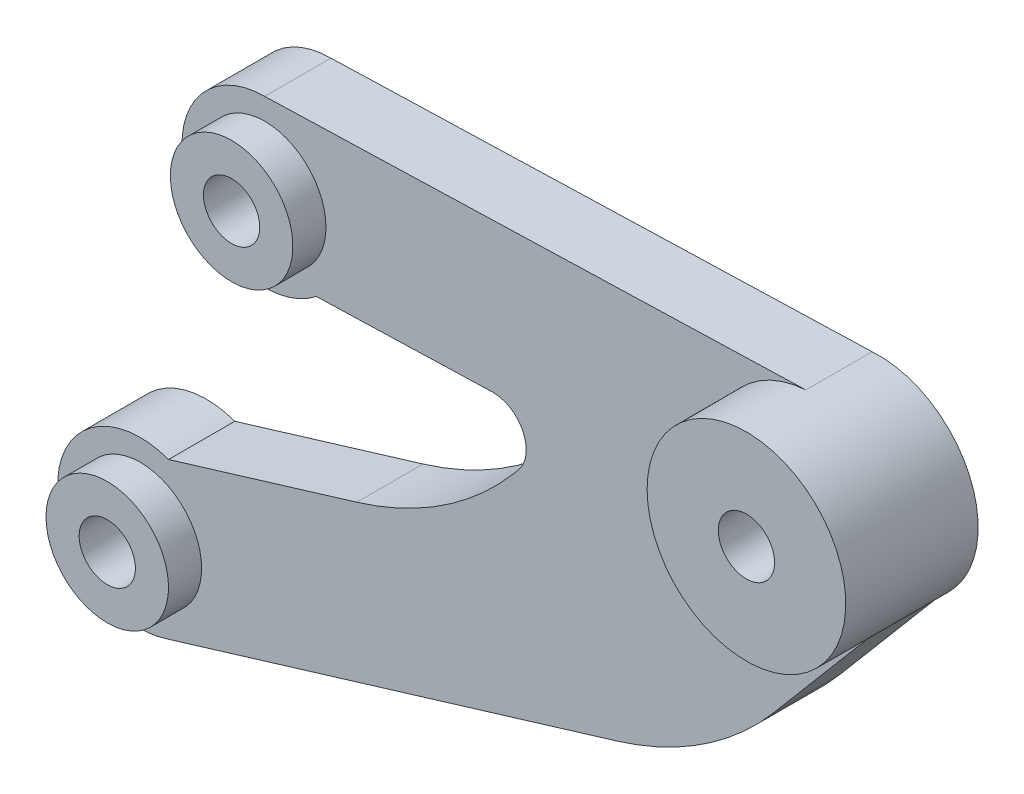
ISO-10303-21;
HEADER;
FILE_DESCRIPTION(('STEP AP214'),'2;1');
FILE_NAME('part.step','',(''),(''),'','','');
FILE_SCHEMA(('AUTOMOTIVE_DESIGN { 1 0 10303 214 1 1 1 1 }'));
ENDSEC;
DATA;
#1=APPLICATION_CONTEXT('core data for automotive mechanical design processes');
#2=APPLICATION_PROTOCOL_DEFINITION('international standard','automotive_design',2000,#1);
#3=PRODUCT_CONTEXT('',#1,'mechanical');
#4=PRODUCT('Part','Part','',(#3));
#5=PRODUCT_RELATED_PRODUCT_CATEGORY('part','',(#4));
#6=PRODUCT_DEFINITION_FORMATION('','',#4);
#7=PRODUCT_DEFINITION_CONTEXT('part definition',#1,'design');
#8=PRODUCT_DEFINITION('design','',#6,#7);
#9=PRODUCT_DEFINITION_SHAPE('','',#8);
#10=(LENGTH_UNIT() NAMED_UNIT(*) SI_UNIT(.MILLI.,.METRE.));
#11=(NAMED_UNIT(*) PLANE_ANGLE_UNIT() SI_UNIT($,.RADIAN.));
#12=(NAMED_UNIT(*) SI_UNIT($,.STERADIAN.) SOLID_ANGLE_UNIT());
#13=UNCERTAINTY_MEASURE_WITH_UNIT(LENGTH_MEASURE(1.E-05),#10,'distance_accuracy_value','');
#14=(GEOMETRIC_REPRESENTATION_CONTEXT(3) GLOBAL_UNCERTAINTY_ASSIGNED_CONTEXT((#13)) GLOBAL_UNIT_ASSIGNED_CONTEXT((#10,
#11,#12)) REPRESENTATION_CONTEXT('',''));
#15=CARTESIAN_POINT('',(0.,0.,0.));
#16=DIRECTION('',(0.,0.,1.));
#17=DIRECTION('',(1.,0.,0.));
#18=AXIS2_PLACEMENT_3D('',#15,#16,#17);
#19=CARTESIAN_POINT('',(-0.794785675554382,26.3501943878582,-2.));
#20=DIRECTION('',(0.0301487106170735,-0.999545424304533,0.));
#21=DIRECTION('',(0.999545424304533,0.0301487106170735,0.));
#22=AXIS2_PLACEMENT_3D('',#19,#20,#21);
#23=PLANE('',#22);
#24=DIRECTION('',(0.,0.,1.));
#25=VECTOR('',#24,1.);
#26=CARTESIAN_POINT('',(7.51288670694863,26.6007739057783,-2.));
#27=LINE('',#26,#25);
#28=CARTESIAN_POINT('',(7.51288670694863,26.6007739057783,-2.));
#29=VERTEX_POINT('',#28);
#30=CARTESIAN_POINT('',(7.51288670694863,26.6007739057783,2.));
#31=VERTEX_POINT('',#30);
#32=EDGE_CURVE('E176',#29,#31,#27,.T.);
#33=ORIENTED_EDGE('',*,*,#32,.T.);
#34=DIRECTION('',(0.999545424304533,0.0301487106170735,0.));
#35=VECTOR('',#34,1.);
#36=CARTESIAN_POINT('',(-0.794785675554382,26.3501943878582,2.));
#37=LINE('',#36,#35);
#38=CARTESIAN_POINT('',(40.203783053973,27.5868105078317,2.));
#39=VERTEX_POINT('',#38);
#40=EDGE_CURVE('E237',#31,#39,#37,.T.);
#41=ORIENTED_EDGE('',*,*,#40,.T.);
#42=DIRECTION('',(0.,0.,1.));
#43=VECTOR('',#42,1.);
#44=CARTESIAN_POINT('',(40.203783053973,27.5868105078317,-2.));
#45=LINE('',#44,#43);
#46=CARTESIAN_POINT('',(40.203783053973,27.5868105078317,-2.));
#47=VERTEX_POINT('',#46);
#48=EDGE_CURVE('E138',#47,#39,#45,.T.);
#49=ORIENTED_EDGE('',*,*,#48,.F.);
#50=DIRECTION('',(0.999545424304533,0.0301487106170735,0.));
#51=VECTOR('',#50,1.);
#52=CARTESIAN_POINT('',(-0.794785675554382,26.3501943878582,-2.));
#53=LINE('',#52,#51);
#54=EDGE_CURVE('E260',#29,#47,#53,.T.);
#55=ORIENTED_EDGE('',*,*,#54,.F.);
#56=EDGE_LOOP('',(#33,#41,#49,#55));
#57=FACE_BOUND('',#56,.T.);
#58=ADVANCED_FACE('F41',(#57),#23,.F.);
#59=CARTESIAN_POINT('',(40.6128867069486,21.6007739057783,-2.));
#60=DIRECTION('',(0.,0.,1.));
#61=DIRECTION('',(1.,0.,0.));
#62=AXIS2_PLACEMENT_3D('',#59,#60,#61);
#63=CYLINDRICAL_SURFACE('',#62,6.);
#64=ORIENTED_EDGE('',*,*,#48,.T.);
#65=CARTESIAN_POINT('',(40.6128867069486,21.6007739057783,2.));
#66=DIRECTION('',(0.,0.,-1.));
#67=DIRECTION('',(-1.,0.,0.));
#68=AXIS2_PLACEMENT_3D('',#65,#66,#67);
#69=CIRCLE('',#68,6.);
#70=CARTESIAN_POINT('',(44.2966352413054,16.8647421559245,2.));
#71=VERTEX_POINT('',#70);
#72=EDGE_CURVE('E129',#71,#39,#69,.T.);
#73=ORIENTED_EDGE('',*,*,#72,.F.);
#74=DIRECTION('',(0.,0.,1.));
#75=VECTOR('',#74,1.);
#76=CARTESIAN_POINT('',(44.2966352413055,16.8647421559245,-2.));
#77=LINE('',#76,#75);
#78=CARTESIAN_POINT('',(44.2966352413055,16.8647421559245,-2.));
#79=VERTEX_POINT('',#78);
#80=EDGE_CURVE('E135',#79,#71,#77,.T.);
#81=ORIENTED_EDGE('',*,*,#80,.F.);
#82=CARTESIAN_POINT('',(40.6128867069486,21.6007739057783,-2.));
#83=DIRECTION('',(0.,0.,1.));
#84=DIRECTION('',(1.,0.,0.));
#85=AXIS2_PLACEMENT_3D('',#82,#83,#84);
#86=CIRCLE('',#85,6.);
#87=EDGE_CURVE('E179',#79,#47,#86,.T.);
#88=ORIENTED_EDGE('',*,*,#87,.T.);
#89=EDGE_LOOP('',(#64,#73,#81,#88));
#90=FACE_BOUND('',#89,.T.);
#91=CARTESIAN_POINT('',(40.6128867069486,21.6007739057783,6.));
#92=DIRECTION('',(0.,0.,-1.));
#93=DIRECTION('',(-1.,0.,0.));
#94=AXIS2_PLACEMENT_3D('',#91,#92,#93);
#95=CIRCLE('',#94,6.);
#96=CARTESIAN_POINT('',(34.6128867069486,21.6007739057783,6.));
#97=VERTEX_POINT('',#96);
#98=EDGE_CURVE('E292',#97,#97,#95,.T.);
#99=ORIENTED_EDGE('',*,*,#98,.T.);
#100=EDGE_LOOP('',(#99));
#101=FACE_BOUND('',#100,.T.);
#102=ADVANCED_FACE('F131',(#90,#101),#63,.T.);
#103=CARTESIAN_POINT('',(17.5048121782462,-14.8074807423079,-2.));
#104=DIRECTION('',(0.763478400343073,-0.645833362570859,0.));
#105=DIRECTION('',(0.645833362570859,0.763478400343073,0.));
#106=AXIS2_PLACEMENT_3D('',#103,#104,#105);
#107=PLANE('',#106);
#108=DIRECTION('',(0.645833362570859,0.763478400343073,0.));
#109=VECTOR('',#108,1.);
#110=CARTESIAN_POINT('',(17.5048121782462,-14.8074807423079,2.));
#111=LINE('',#110,#109);
#112=CARTESIAN_POINT('',(38.2696943494356,9.7399334084015,2.));
#113=VERTEX_POINT('',#112);
#114=EDGE_CURVE('E146',#113,#71,#111,.T.);
#115=ORIENTED_EDGE('',*,*,#114,.F.);
#116=DIRECTION('',(0.,0.,1.));
#117=VECTOR('',#116,1.);
#118=CARTESIAN_POINT('',(38.2696943494356,9.73993340840149,-2.));
#119=LINE('',#118,#117);
#120=CARTESIAN_POINT('',(38.2696943494356,9.7399334084015,-2.));
#121=VERTEX_POINT('',#120);
#122=EDGE_CURVE('E192',#113,#121,#119,.F.);
#123=ORIENTED_EDGE('',*,*,#122,.T.);
#124=DIRECTION('',(0.645833362570859,0.763478400343073,0.));
#125=VECTOR('',#124,1.);
#126=CARTESIAN_POINT('',(17.5048121782462,-14.8074807423079,-2.));
#127=LINE('',#126,#125);
#128=EDGE_CURVE('E158',#121,#79,#127,.T.);
#129=ORIENTED_EDGE('',*,*,#128,.T.);
#130=ORIENTED_EDGE('',*,*,#80,.T.);
#131=EDGE_LOOP('',(#115,#123,#129,#130));
#132=FACE_BOUND('',#131,.T.);
#133=ADVANCED_FACE('F156',(#132),#107,.T.);
#134=CARTESIAN_POINT('',(1.45139171596717,-4.78294599887616,-2.));
#135=DIRECTION('',(0.290376446947038,-0.956912492894943,0.));
#136=DIRECTION('',(0.956912492894943,0.290376446947038,0.));
#137=AXIS2_PLACEMENT_3D('',#134,#135,#136);
#138=PLANE('',#137);
#139=DIRECTION('',(0.956912492894943,0.290376446947038,0.));
#140=VECTOR('',#139,1.);
#141=CARTESIAN_POINT('',(1.45139171596717,-4.78294599887616,-2.));
#142=LINE('',#141,#140);
#143=CARTESIAN_POINT('',(1.57575227360064,-4.74520861208887,-2.));
#144=VERTEX_POINT('',#143);
#145=CARTESIAN_POINT('',(28.8076552815149,3.5183508019198,-2.));
#146=VERTEX_POINT('',#145);
#147=EDGE_CURVE('E279',#144,#146,#142,.T.);
#148=ORIENTED_EDGE('',*,*,#147,.T.);
#149=DIRECTION('',(0.,0.,1.));
#150=VECTOR('',#149,1.);
#151=CARTESIAN_POINT('',(28.8076552815149,3.5183508019198,-2.));
#152=LINE('',#151,#150);
#153=CARTESIAN_POINT('',(28.8076552815149,3.5183508019198,2.));
#154=VERTEX_POINT('',#153);
#155=EDGE_CURVE('E186',#146,#154,#152,.T.);
#156=ORIENTED_EDGE('',*,*,#155,.T.);
#157=DIRECTION('',(0.956912492894943,0.290376446947038,0.));
#158=VECTOR('',#157,1.);
#159=CARTESIAN_POINT('',(1.45139171596717,-4.78294599887616,2.));
#160=LINE('',#159,#158);
#161=CARTESIAN_POINT('',(1.57575227360064,-4.74520861208887,2.));
#162=VERTEX_POINT('',#161);
#163=EDGE_CURVE('E154',#162,#154,#160,.T.);
#164=ORIENTED_EDGE('',*,*,#163,.F.);
#165=DIRECTION('',(0.,0.,1.));
#166=VECTOR('',#165,1.);
#167=CARTESIAN_POINT('',(1.57575227360064,-4.74520861208887,-2.));
#168=LINE('',#167,#166);
#169=EDGE_CURVE('E160',#144,#162,#168,.T.);
#170=ORIENTED_EDGE('',*,*,#169,.F.);
#171=EDGE_LOOP('',(#148,#156,#164,#170));
#172=FACE_BOUND('',#171,.T.);
#173=ADVANCED_FACE('F387',(#172),#138,.T.);
#174=CARTESIAN_POINT('',(0.,0.,-2.));
#175=DIRECTION('',(0.,0.,1.));
#176=DIRECTION('',(1.,0.,0.));
#177=AXIS2_PLACEMENT_3D('',#174,#175,#176);
#178=CYLINDRICAL_SURFACE('',#177,5.);
#179=ORIENTED_EDGE('',*,*,#169,.T.);
#180=CARTESIAN_POINT('',(0.,0.,2.));
#181=DIRECTION('',(0.,0.,1.));
#182=DIRECTION('',(1.,0.,0.));
#183=AXIS2_PLACEMENT_3D('',#180,#181,#182);
#184=CIRCLE('',#183,5.);
#185=CARTESIAN_POINT('',(1.70658461953951,4.69974136909162,2.));
#186=VERTEX_POINT('',#185);
#187=EDGE_CURVE('E243',#186,#162,#184,.T.);
#188=ORIENTED_EDGE('',*,*,#187,.F.);
#189=DIRECTION('',(0.,0.,1.));
#190=VECTOR('',#189,1.);
#191=CARTESIAN_POINT('',(1.70658461953951,4.69974136909162,-2.));
#192=LINE('',#191,#190);
#193=CARTESIAN_POINT('',(1.70658461953951,4.69974136909162,-2.));
#194=VERTEX_POINT('',#193);
#195=EDGE_CURVE('E166',#194,#186,#192,.T.);
#196=ORIENTED_EDGE('',*,*,#195,.F.);
#197=CARTESIAN_POINT('',(0.,0.,-2.));
#198=DIRECTION('',(0.,0.,1.));
#199=DIRECTION('',(1.,0.,0.));
#200=AXIS2_PLACEMENT_3D('',#197,#198,#199);
#201=CIRCLE('',#200,5.);
#202=EDGE_CURVE('E275',#194,#144,#201,.T.);
#203=ORIENTED_EDGE('',*,*,#202,.T.);
#204=EDGE_LOOP('',(#179,#188,#196,#203));
#205=FACE_BOUND('',#204,.T.);
#206=ADVANCED_FACE('F390',(#205),#178,.T.);
#207=CARTESIAN_POINT('',(-1.16199630655618,3.82926643717832,-2.));
#208=DIRECTION('',(-0.290376446947038,0.956912492894943,0.));
#209=DIRECTION('',(-0.956912492894943,-0.290376446947038,0.));
#210=AXIS2_PLACEMENT_3D('',#207,#208,#209);
#211=PLANE('',#210);
#212=DIRECTION('',(-0.956912492894943,-0.290376446947038,0.));
#213=VECTOR('',#212,1.);
#214=CARTESIAN_POINT('',(-1.16199630655618,3.82926643717832,2.));
#215=LINE('',#214,#213);
#216=CARTESIAN_POINT('',(13.0793967045248,8.15083725252361,2.));
#217=VERTEX_POINT('',#216);
#218=EDGE_CURVE('E235',#217,#186,#215,.T.);
#219=ORIENTED_EDGE('',*,*,#218,.F.);
#220=DIRECTION('',(0.,0.,1.));
#221=VECTOR('',#220,1.);
#222=CARTESIAN_POINT('',(13.0793967045248,8.15083725252361,-2.));
#223=LINE('',#222,#221);
#224=CARTESIAN_POINT('',(13.0793967045248,8.15083725252361,-2.));
#225=VERTEX_POINT('',#224);
#226=EDGE_CURVE('E183',#217,#225,#223,.F.);
#227=ORIENTED_EDGE('',*,*,#226,.T.);
#228=DIRECTION('',(-0.956912492894943,-0.290376446947038,0.));
#229=VECTOR('',#228,1.);
#230=CARTESIAN_POINT('',(-1.16199630655618,3.82926643717832,-2.));
#231=LINE('',#230,#229);
#232=EDGE_CURVE('E272',#225,#194,#231,.T.);
#233=ORIENTED_EDGE('',*,*,#232,.T.);
#234=ORIENTED_EDGE('',*,*,#195,.T.);
#235=EDGE_LOOP('',(#219,#227,#233,#234));
#236=FACE_BOUND('',#235,.T.);
#237=ADVANCED_FACE('F394',(#236),#211,.T.);
#238=CARTESIAN_POINT('',(6.0526361731001,-5.11998030374497,-2.));
#239=DIRECTION('',(-0.763478400343073,0.645833362570859,0.));
#240=DIRECTION('',(-0.645833362570859,-0.763478400343073,0.));
#241=AXIS2_PLACEMENT_3D('',#238,#239,#240);
#242=PLANE('',#241);
#243=DIRECTION('',(-0.645833362570859,-0.763478400343073,0.));
#244=VECTOR('',#243,1.);
#245=CARTESIAN_POINT('',(6.0526361731001,-5.11998030374497,2.));
#246=LINE('',#245,#244);
#247=CARTESIAN_POINT('',(22.8356424846143,14.7202192806435,2.));
#248=VERTEX_POINT('',#247);
#249=CARTESIAN_POINT('',(22.5414357724455,14.3724198590053,2.));
#250=VERTEX_POINT('',#249);
#251=EDGE_CURVE('E231',#248,#250,#246,.T.);
#252=ORIENTED_EDGE('',*,*,#251,.F.);
#253=DIRECTION('',(0.,0.,1.));
#254=VECTOR('',#253,1.);
#255=CARTESIAN_POINT('',(22.8356424846143,14.7202192806435,-2.));
#256=LINE('',#255,#254);
#257=CARTESIAN_POINT('',(22.8356424846143,14.7202192806435,-2.));
#258=VERTEX_POINT('',#257);
#259=EDGE_CURVE('E63',#248,#258,#256,.F.);
#260=ORIENTED_EDGE('',*,*,#259,.T.);
#261=DIRECTION('',(-0.645833362570859,-0.763478400343073,0.));
#262=VECTOR('',#261,1.);
#263=CARTESIAN_POINT('',(6.0526361731001,-5.11998030374497,-2.));
#264=LINE('',#263,#262);
#265=CARTESIAN_POINT('',(22.5414357724455,14.3724198590053,-2.));
#266=VERTEX_POINT('',#265);
#267=EDGE_CURVE('E269',#258,#266,#264,.T.);
#268=ORIENTED_EDGE('',*,*,#267,.T.);
#269=DIRECTION('',(0.,0.,1.));
#270=VECTOR('',#269,1.);
#271=CARTESIAN_POINT('',(22.5414357724455,14.3724198590053,2.));
#272=LINE('',#271,#270);
#273=EDGE_CURVE('E164',#266,#250,#272,.T.);
#274=ORIENTED_EDGE('',*,*,#273,.T.);
#275=EDGE_LOOP('',(#252,#260,#268,#274));
#276=FACE_BOUND('',#275,.T.);
#277=ADVANCED_FACE('F351',(#276),#242,.T.);
#278=CARTESIAN_POINT('',(-0.523447280000722,17.3542855691174,-2.));
#279=DIRECTION('',(0.0301487106170736,-0.999545424304533,0.));
#280=DIRECTION('',(0.999545424304533,0.0301487106170736,0.));
#281=AXIS2_PLACEMENT_3D('',#278,#279,#280);
#282=PLANE('',#281);
#283=DIRECTION('',(0.999545424304533,0.0301487106170736,0.));
#284=VECTOR('',#283,1.);
#285=CARTESIAN_POINT('',(-0.523447280000722,17.3542855691174,-2.));
#286=LINE('',#285,#284);
#287=CARTESIAN_POINT('',(10.6291548266564,17.6906750571438,-2.));
#288=VERTEX_POINT('',#287);
#289=CARTESIAN_POINT('',(21.248388262694,18.0109768543943,-2.));
#290=VERTEX_POINT('',#289);
#291=EDGE_CURVE('E225',#288,#290,#286,.T.);
#292=ORIENTED_EDGE('',*,*,#291,.T.);
#293=DIRECTION('',(0.,0.,1.));
#294=VECTOR('',#293,1.);
#295=CARTESIAN_POINT('',(21.248388262694,18.0109768543943,2.));
#296=LINE('',#295,#294);
#297=CARTESIAN_POINT('',(21.248388262694,18.0109768543943,2.));
#298=VERTEX_POINT('',#297);
#299=EDGE_CURVE('E211',#290,#298,#296,.T.);
#300=ORIENTED_EDGE('',*,*,#299,.T.);
#301=DIRECTION('',(0.999545424304533,0.0301487106170736,0.));
#302=VECTOR('',#301,1.);
#303=CARTESIAN_POINT('',(-0.523447280000722,17.3542855691174,2.));
#304=LINE('',#303,#302);
#305=CARTESIAN_POINT('',(10.6291548266564,17.6906750571438,2.));
#306=VERTEX_POINT('',#305);
#307=EDGE_CURVE('E222',#306,#298,#304,.T.);
#308=ORIENTED_EDGE('',*,*,#307,.F.);
#309=DIRECTION('',(0.,0.,1.));
#310=VECTOR('',#309,1.);
#311=CARTESIAN_POINT('',(10.6291548266564,17.6906750571438,-2.));
#312=LINE('',#311,#310);
#313=EDGE_CURVE('E173',#288,#306,#312,.T.);
#314=ORIENTED_EDGE('',*,*,#313,.F.);
#315=EDGE_LOOP('',(#292,#300,#308,#314));
#316=FACE_BOUND('',#315,.T.);
#317=ADVANCED_FACE('F221',(#316),#282,.T.);
#318=CARTESIAN_POINT('',(7.51288670694863,21.6007739057783,-2.));
#319=DIRECTION('',(0.,0.,1.));
#320=DIRECTION('',(1.,0.,0.));
#321=AXIS2_PLACEMENT_3D('',#318,#319,#320);
#322=CYLINDRICAL_SURFACE('',#321,1.7);
#323=CARTESIAN_POINT('',(7.51288670694863,21.6007739057783,-2.));
#324=DIRECTION('',(0.,0.,1.));
#325=DIRECTION('',(1.,0.,0.));
#326=AXIS2_PLACEMENT_3D('',#323,#324,#325);
#327=CIRCLE('',#326,1.7);
#328=CARTESIAN_POINT('',(9.21288670694863,21.6007739057783,-2.));
#329=VERTEX_POINT('',#328);
#330=EDGE_CURVE('E256',#329,#329,#327,.T.);
#331=ORIENTED_EDGE('',*,*,#330,.F.);
#332=EDGE_LOOP('',(#331));
#333=FACE_BOUND('',#332,.T.);
#334=CARTESIAN_POINT('',(7.51288670694863,21.6007739057783,4.));
#335=DIRECTION('',(0.,0.,-1.));
#336=DIRECTION('',(-1.,0.,0.));
#337=AXIS2_PLACEMENT_3D('',#334,#335,#336);
#338=CIRCLE('',#337,1.7);
#339=CARTESIAN_POINT('',(5.81288670694863,21.6007739057783,4.));
#340=VERTEX_POINT('',#339);
#341=EDGE_CURVE('E305',#340,#340,#338,.T.);
#342=ORIENTED_EDGE('',*,*,#341,.F.);
#343=EDGE_LOOP('',(#342));
#344=FACE_BOUND('',#343,.T.);
#345=ADVANCED_FACE('F333',(#333,#344),#322,.F.);
#346=CARTESIAN_POINT('',(40.6128867069486,21.6007739057783,-2.));
#347=DIRECTION('',(0.,0.,1.));
#348=DIRECTION('',(1.,0.,0.));
#349=AXIS2_PLACEMENT_3D('',#346,#347,#348);
#350=CYLINDRICAL_SURFACE('',#349,1.7);
#351=CARTESIAN_POINT('',(40.6128867069486,21.6007739057783,-2.));
#352=DIRECTION('',(0.,0.,1.));
#353=DIRECTION('',(1.,0.,0.));
#354=AXIS2_PLACEMENT_3D('',#351,#352,#353);
#355=CIRCLE('',#354,1.7);
#356=CARTESIAN_POINT('',(42.3128867069486,21.6007739057783,-2.));
#357=VERTEX_POINT('',#356);
#358=EDGE_CURVE('E252',#357,#357,#355,.T.);
#359=ORIENTED_EDGE('',*,*,#358,.F.);
#360=EDGE_LOOP('',(#359));
#361=FACE_BOUND('',#360,.T.);
#362=CARTESIAN_POINT('',(40.6128867069486,21.6007739057783,6.));
#363=DIRECTION('',(0.,0.,-1.));
#364=DIRECTION('',(-1.,0.,0.));
#365=AXIS2_PLACEMENT_3D('',#362,#363,#364);
#366=CIRCLE('',#365,1.7);
#367=CARTESIAN_POINT('',(38.9128867069486,21.6007739057783,6.));
#368=VERTEX_POINT('',#367);
#369=EDGE_CURVE('E295',#368,#368,#366,.T.);
#370=ORIENTED_EDGE('',*,*,#369,.F.);
#371=EDGE_LOOP('',(#370));
#372=FACE_BOUND('',#371,.T.);
#373=ADVANCED_FACE('F324',(#361,#372),#350,.F.);
#374=CARTESIAN_POINT('',(0.,0.,-2.));
#375=DIRECTION('',(0.,0.,1.));
#376=DIRECTION('',(1.,0.,0.));
#377=AXIS2_PLACEMENT_3D('',#374,#375,#376);
#378=CYLINDRICAL_SURFACE('',#377,1.7);
#379=CARTESIAN_POINT('',(0.,0.,-2.));
#380=DIRECTION('',(0.,0.,1.));
#381=DIRECTION('',(1.,0.,0.));
#382=AXIS2_PLACEMENT_3D('',#379,#380,#381);
#383=CIRCLE('',#382,1.7);
#384=CARTESIAN_POINT('',(1.7,0.,-2.));
#385=VERTEX_POINT('',#384);
#386=EDGE_CURVE('E153',#385,#385,#383,.T.);
#387=ORIENTED_EDGE('',*,*,#386,.F.);
#388=EDGE_LOOP('',(#387));
#389=FACE_BOUND('',#388,.T.);
#390=CARTESIAN_POINT('',(0.,0.,4.));
#391=DIRECTION('',(0.,0.,-1.));
#392=DIRECTION('',(-1.,0.,0.));
#393=AXIS2_PLACEMENT_3D('',#390,#391,#392);
#394=CIRCLE('',#393,1.7);
#395=CARTESIAN_POINT('',(-1.7,0.,4.));
#396=VERTEX_POINT('',#395);
#397=EDGE_CURVE('E313',#396,#396,#394,.T.);
#398=ORIENTED_EDGE('',*,*,#397,.F.);
#399=EDGE_LOOP('',(#398));
#400=FACE_BOUND('',#399,.T.);
#401=ADVANCED_FACE('F321',(#389,#400),#378,.F.);
#402=CARTESIAN_POINT('',(7.51288670694863,21.6007739057783,-2.));
#403=DIRECTION('',(0.,0.,1.));
#404=DIRECTION('',(1.,0.,0.));
#405=AXIS2_PLACEMENT_3D('',#402,#403,#404);
#406=CYLINDRICAL_SURFACE('',#405,5.);
#407=ORIENTED_EDGE('',*,*,#313,.T.);
#408=CARTESIAN_POINT('',(7.51288670694863,21.6007739057783,2.));
#409=DIRECTION('',(0.,0.,1.));
#410=DIRECTION('',(1.,0.,0.));
#411=AXIS2_PLACEMENT_3D('',#408,#409,#410);
#412=CIRCLE('',#411,5.);
#413=EDGE_CURVE('E229',#31,#306,#412,.T.);
#414=ORIENTED_EDGE('',*,*,#413,.F.);
#415=ORIENTED_EDGE('',*,*,#32,.F.);
#416=CARTESIAN_POINT('',(7.51288670694863,21.6007739057783,-2.));
#417=DIRECTION('',(0.,0.,1.));
#418=DIRECTION('',(1.,0.,0.));
#419=AXIS2_PLACEMENT_3D('',#416,#417,#418);
#420=CIRCLE('',#419,5.);
#421=EDGE_CURVE('E263',#29,#288,#420,.T.);
#422=ORIENTED_EDGE('',*,*,#421,.T.);
#423=EDGE_LOOP('',(#407,#414,#415,#422));
#424=FACE_BOUND('',#423,.T.);
#425=ADVANCED_FACE('F323',(#424),#406,.T.);
#426=CARTESIAN_POINT('',(0.,0.,-2.));
#427=DIRECTION('',(0.,0.,1.));
#428=DIRECTION('',(1.,0.,0.));
#429=AXIS2_PLACEMENT_3D('',#426,#427,#428);
#430=PLANE('',#429);
#431=ORIENTED_EDGE('',*,*,#386,.T.);
#432=EDGE_LOOP('',(#431));
#433=FACE_BOUND('',#432,.T.);
#434=ORIENTED_EDGE('',*,*,#358,.T.);
#435=EDGE_LOOP('',(#434));
#436=FACE_BOUND('',#435,.T.);
#437=ORIENTED_EDGE('',*,*,#330,.T.);
#438=EDGE_LOOP('',(#437));
#439=FACE_BOUND('',#438,.T.);
#440=ORIENTED_EDGE('',*,*,#128,.F.);
#441=CARTESIAN_POINT('',(23.0001263425741,22.6566006598187,-2.));
#442=DIRECTION('',(0.,0.,1.));
#443=DIRECTION('',(1.,0.,0.));
#444=AXIS2_PLACEMENT_3D('',#441,#442,#443);
#445=CIRCLE('',#444,20.);
#446=EDGE_CURVE('E195',#121,#146,#445,.F.);
#447=ORIENTED_EDGE('',*,*,#446,.T.);
#448=ORIENTED_EDGE('',*,*,#147,.F.);
#449=ORIENTED_EDGE('',*,*,#202,.F.);
#450=ORIENTED_EDGE('',*,*,#232,.F.);
#451=CARTESIAN_POINT('',(7.27186776558407,27.2890871104225,-2.));
#452=DIRECTION('',(0.,0.,1.));
#453=DIRECTION('',(1.,0.,0.));
#454=AXIS2_PLACEMENT_3D('',#451,#452,#453);
#455=CIRCLE('',#454,20.);
#456=EDGE_CURVE('E143',#225,#266,#455,.T.);
#457=ORIENTED_EDGE('',*,*,#456,.T.);
#458=ORIENTED_EDGE('',*,*,#267,.F.);
#459=CARTESIAN_POINT('',(21.3086856839282,16.0118860057853,-2.));
#460=DIRECTION('',(0.,0.,1.));
#461=DIRECTION('',(1.,0.,0.));
#462=AXIS2_PLACEMENT_3D('',#459,#460,#461);
#463=CIRCLE('',#462,2.);
#464=EDGE_CURVE('E11',#258,#290,#463,.T.);
#465=ORIENTED_EDGE('',*,*,#464,.T.);
#466=ORIENTED_EDGE('',*,*,#291,.F.);
#467=ORIENTED_EDGE('',*,*,#421,.F.);
#468=ORIENTED_EDGE('',*,*,#54,.T.);
#469=ORIENTED_EDGE('',*,*,#87,.F.);
#470=EDGE_LOOP('',(#440,#447,#448,#449,#450,#457,#458,#465,#466,#467,#468,#469));
#471=FACE_BOUND('',#470,.T.);
#472=ADVANCED_FACE('F286',(#433,#436,#439,#471),#430,.F.);
#473=CARTESIAN_POINT('',(0.,0.,2.));
#474=DIRECTION('',(0.,0.,1.));
#475=DIRECTION('',(1.,0.,0.));
#476=AXIS2_PLACEMENT_3D('',#473,#474,#475);
#477=PLANE('',#476);
#478=CARTESIAN_POINT('',(0.,0.,2.));
#479=DIRECTION('',(0.,0.,1.));
#480=DIRECTION('',(1.,0.,0.));
#481=AXIS2_PLACEMENT_3D('',#478,#479,#480);
#482=CIRCLE('',#481,3.7);
#483=CARTESIAN_POINT('',(3.7,0.,2.));
#484=VERTEX_POINT('',#483);
#485=EDGE_CURVE('E207',#484,#484,#482,.T.);
#486=ORIENTED_EDGE('',*,*,#485,.F.);
#487=EDGE_LOOP('',(#486));
#488=FACE_BOUND('',#487,.T.);
#489=CARTESIAN_POINT('',(7.51288670694863,21.6007739057783,2.));
#490=DIRECTION('',(0.,0.,1.));
#491=DIRECTION('',(1.,0.,0.));
#492=AXIS2_PLACEMENT_3D('',#489,#490,#491);
#493=CIRCLE('',#492,3.7);
#494=CARTESIAN_POINT('',(11.2128867069486,21.6007739057783,2.));
#495=VERTEX_POINT('',#494);
#496=EDGE_CURVE('E142',#495,#495,#493,.T.);
#497=ORIENTED_EDGE('',*,*,#496,.F.);
#498=EDGE_LOOP('',(#497));
#499=FACE_BOUND('',#498,.T.);
#500=ORIENTED_EDGE('',*,*,#114,.T.);
#501=ORIENTED_EDGE('',*,*,#72,.T.);
#502=ORIENTED_EDGE('',*,*,#40,.F.);
#503=ORIENTED_EDGE('',*,*,#413,.T.);
#504=ORIENTED_EDGE('',*,*,#307,.T.);
#505=CARTESIAN_POINT('',(21.3086856839282,16.0118860057853,2.));
#506=DIRECTION('',(0.,0.,1.));
#507=DIRECTION('',(1.,0.,0.));
#508=AXIS2_PLACEMENT_3D('',#505,#506,#507);
#509=CIRCLE('',#508,2.);
#510=EDGE_CURVE('E50',#298,#248,#509,.F.);
#511=ORIENTED_EDGE('',*,*,#510,.T.);
#512=ORIENTED_EDGE('',*,*,#251,.T.);
#513=CARTESIAN_POINT('',(7.27186776558407,27.2890871104225,2.));
#514=DIRECTION('',(0.,0.,1.));
#515=DIRECTION('',(1.,0.,0.));
#516=AXIS2_PLACEMENT_3D('',#513,#514,#515);
#517=CIRCLE('',#516,20.);
#518=EDGE_CURVE('E198',#250,#217,#517,.F.);
#519=ORIENTED_EDGE('',*,*,#518,.T.);
#520=ORIENTED_EDGE('',*,*,#218,.T.);
#521=ORIENTED_EDGE('',*,*,#187,.T.);
#522=ORIENTED_EDGE('',*,*,#163,.T.);
#523=CARTESIAN_POINT('',(23.0001263425741,22.6566006598187,2.));
#524=DIRECTION('',(0.,0.,1.));
#525=DIRECTION('',(1.,0.,0.));
#526=AXIS2_PLACEMENT_3D('',#523,#524,#525);
#527=CIRCLE('',#526,20.);
#528=EDGE_CURVE('E149',#154,#113,#527,.T.);
#529=ORIENTED_EDGE('',*,*,#528,.T.);
#530=EDGE_LOOP('',(#500,#501,#502,#503,#504,#511,#512,#519,#520,#521,#522,#529));
#531=FACE_BOUND('',#530,.T.);
#532=ADVANCED_FACE('F147',(#488,#499,#531),#477,.T.);
#533=CARTESIAN_POINT('',(7.27186776558407,27.2890871104225,-2.));
#534=DIRECTION('',(0.,0.,-1.));
#535=DIRECTION('',(-1.,0.,0.));
#536=AXIS2_PLACEMENT_3D('',#533,#534,#535);
#537=CYLINDRICAL_SURFACE('',#536,20.);
#538=ORIENTED_EDGE('',*,*,#456,.F.);
#539=ORIENTED_EDGE('',*,*,#226,.F.);
#540=ORIENTED_EDGE('',*,*,#518,.F.);
#541=ORIENTED_EDGE('',*,*,#273,.F.);
#542=EDGE_LOOP('',(#538,#539,#540,#541));
#543=FACE_BOUND('',#542,.T.);
#544=ADVANCED_FACE('F371',(#543),#537,.F.);
#545=CARTESIAN_POINT('',(23.0001263425741,22.6566006598187,-2.));
#546=DIRECTION('',(0.,0.,1.));
#547=DIRECTION('',(1.,0.,0.));
#548=AXIS2_PLACEMENT_3D('',#545,#546,#547);
#549=CYLINDRICAL_SURFACE('',#548,20.);
#550=ORIENTED_EDGE('',*,*,#446,.F.);
#551=ORIENTED_EDGE('',*,*,#122,.F.);
#552=ORIENTED_EDGE('',*,*,#528,.F.);
#553=ORIENTED_EDGE('',*,*,#155,.F.);
#554=EDGE_LOOP('',(#550,#551,#552,#553));
#555=FACE_BOUND('',#554,.T.);
#556=ADVANCED_FACE('F378',(#555),#549,.T.);
#557=CARTESIAN_POINT('',(40.6128867069486,21.6007739057783,6.));
#558=DIRECTION('',(0.,0.,-1.));
#559=DIRECTION('',(-1.,0.,0.));
#560=AXIS2_PLACEMENT_3D('',#557,#558,#559);
#561=PLANE('',#560);
#562=ORIENTED_EDGE('',*,*,#369,.T.);
#563=EDGE_LOOP('',(#562));
#564=FACE_BOUND('',#563,.T.);
#565=ORIENTED_EDGE('',*,*,#98,.F.);
#566=EDGE_LOOP('',(#565));
#567=FACE_BOUND('',#566,.T.);
#568=ADVANCED_FACE('F366',(#564,#567),#561,.F.);
#569=CARTESIAN_POINT('',(7.51288670694863,21.6007739057783,4.));
#570=DIRECTION('',(0.,0.,-1.));
#571=DIRECTION('',(-1.,0.,0.));
#572=AXIS2_PLACEMENT_3D('',#569,#570,#571);
#573=CYLINDRICAL_SURFACE('',#572,3.7);
#574=CARTESIAN_POINT('',(7.51288670694863,21.6007739057783,4.));
#575=DIRECTION('',(0.,0.,-1.));
#576=DIRECTION('',(-1.,0.,0.));
#577=AXIS2_PLACEMENT_3D('',#574,#575,#576);
#578=CIRCLE('',#577,3.7);
#579=CARTESIAN_POINT('',(3.81288670694863,21.6007739057783,4.));
#580=VERTEX_POINT('',#579);
#581=EDGE_CURVE('E301',#580,#580,#578,.T.);
#582=ORIENTED_EDGE('',*,*,#581,.T.);
#583=EDGE_LOOP('',(#582));
#584=FACE_BOUND('',#583,.T.);
#585=ORIENTED_EDGE('',*,*,#496,.T.);
#586=EDGE_LOOP('',(#585));
#587=FACE_BOUND('',#586,.T.);
#588=ADVANCED_FACE('F360',(#584,#587),#573,.T.);
#589=CARTESIAN_POINT('',(7.51288670694863,21.6007739057783,4.));
#590=DIRECTION('',(0.,0.,-1.));
#591=DIRECTION('',(-1.,0.,0.));
#592=AXIS2_PLACEMENT_3D('',#589,#590,#591);
#593=PLANE('',#592);
#594=ORIENTED_EDGE('',*,*,#341,.T.);
#595=EDGE_LOOP('',(#594));
#596=FACE_BOUND('',#595,.T.);
#597=ORIENTED_EDGE('',*,*,#581,.F.);
#598=EDGE_LOOP('',(#597));
#599=FACE_BOUND('',#598,.T.);
#600=ADVANCED_FACE('F356',(#596,#599),#593,.F.);
#601=CARTESIAN_POINT('',(0.,0.,4.));
#602=DIRECTION('',(0.,0.,-1.));
#603=DIRECTION('',(-1.,0.,0.));
#604=AXIS2_PLACEMENT_3D('',#601,#602,#603);
#605=CYLINDRICAL_SURFACE('',#604,3.7);
#606=CARTESIAN_POINT('',(0.,0.,4.));
#607=DIRECTION('',(0.,0.,-1.));
#608=DIRECTION('',(-1.,0.,0.));
#609=AXIS2_PLACEMENT_3D('',#606,#607,#608);
#610=CIRCLE('',#609,3.7);
#611=CARTESIAN_POINT('',(-3.7,0.,4.));
#612=VERTEX_POINT('',#611);
#613=EDGE_CURVE('E309',#612,#612,#610,.T.);
#614=ORIENTED_EDGE('',*,*,#613,.T.);
#615=EDGE_LOOP('',(#614));
#616=FACE_BOUND('',#615,.T.);
#617=ORIENTED_EDGE('',*,*,#485,.T.);
#618=EDGE_LOOP('',(#617));
#619=FACE_BOUND('',#618,.T.);
#620=ADVANCED_FACE('F359',(#616,#619),#605,.T.);
#621=CARTESIAN_POINT('',(0.,0.,4.));
#622=DIRECTION('',(0.,0.,-1.));
#623=DIRECTION('',(-1.,0.,0.));
#624=AXIS2_PLACEMENT_3D('',#621,#622,#623);
#625=PLANE('',#624);
#626=ORIENTED_EDGE('',*,*,#397,.T.);
#627=EDGE_LOOP('',(#626));
#628=FACE_BOUND('',#627,.T.);
#629=ORIENTED_EDGE('',*,*,#613,.F.);
#630=EDGE_LOOP('',(#629));
#631=FACE_BOUND('',#630,.T.);
#632=ADVANCED_FACE('F318',(#628,#631),#625,.F.);
#633=CARTESIAN_POINT('',(21.3086856839282,16.0118860057853,-2.));
#634=DIRECTION('',(0.,0.,-1.));
#635=DIRECTION('',(-1.,0.,0.));
#636=AXIS2_PLACEMENT_3D('',#633,#634,#635);
#637=CYLINDRICAL_SURFACE('',#636,2.);
#638=ORIENTED_EDGE('',*,*,#464,.F.);
#639=ORIENTED_EDGE('',*,*,#259,.F.);
#640=ORIENTED_EDGE('',*,*,#510,.F.);
#641=ORIENTED_EDGE('',*,*,#299,.F.);
#642=EDGE_LOOP('',(#638,#639,#640,#641));
#643=FACE_BOUND('',#642,.T.);
#644=ADVANCED_FACE('F43',(#643),#637,.F.);
#645=CLOSED_SHELL('',(#58,#102,#133,#173,#206,#237,#277,#317,#345,#373,#401,#425,#472,#532,#544,
#556,#568,#588,#600,#620,#632,#644));
#646=MANIFOLD_SOLID_BREP('B2',#645);
#647=ADVANCED_BREP_SHAPE_REPRESENTATION('',(#18,#646),#14);
#648=SHAPE_DEFINITION_REPRESENTATION(#9,#647);
ENDSEC;
END-ISO-10303-21;
